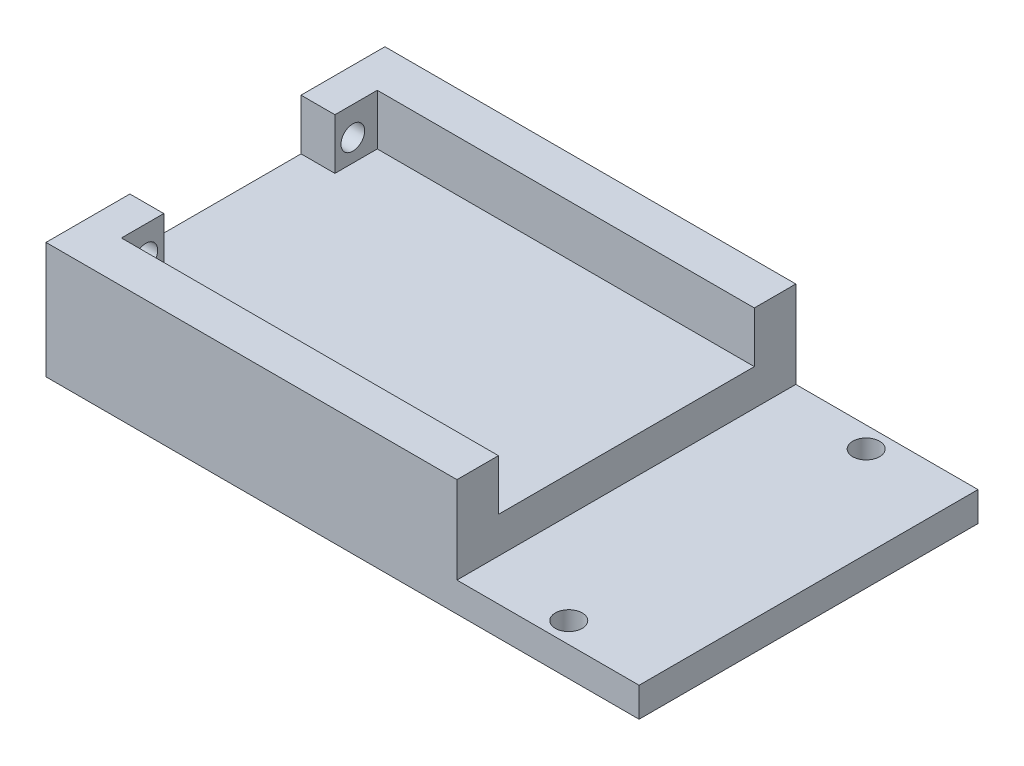
ISO-10303-21;
HEADER;
FILE_DESCRIPTION(('STEP AP214'),'2;1');
FILE_NAME('part.step','',(''),(''),'','','');
FILE_SCHEMA(('AUTOMOTIVE_DESIGN { 1 0 10303 214 1 1 1 1 }'));
ENDSEC;
DATA;
#1=APPLICATION_CONTEXT('core data for automotive mechanical design processes');
#2=APPLICATION_PROTOCOL_DEFINITION('international standard','automotive_design',2000,#1);
#3=PRODUCT_CONTEXT('',#1,'mechanical');
#4=PRODUCT('Part','Part','',(#3));
#5=PRODUCT_RELATED_PRODUCT_CATEGORY('part','',(#4));
#6=PRODUCT_DEFINITION_FORMATION('','',#4);
#7=PRODUCT_DEFINITION_CONTEXT('part definition',#1,'design');
#8=PRODUCT_DEFINITION('design','',#6,#7);
#9=PRODUCT_DEFINITION_SHAPE('','',#8);
#10=(LENGTH_UNIT() NAMED_UNIT(*) SI_UNIT(.MILLI.,.METRE.));
#11=(NAMED_UNIT(*) PLANE_ANGLE_UNIT() SI_UNIT($,.RADIAN.));
#12=(NAMED_UNIT(*) SI_UNIT($,.STERADIAN.) SOLID_ANGLE_UNIT());
#13=UNCERTAINTY_MEASURE_WITH_UNIT(LENGTH_MEASURE(1.E-05),#10,'distance_accuracy_value','');
#14=(GEOMETRIC_REPRESENTATION_CONTEXT(3) GLOBAL_UNCERTAINTY_ASSIGNED_CONTEXT((#13)) GLOBAL_UNIT_ASSIGNED_CONTEXT((#10,
#11,#12)) REPRESENTATION_CONTEXT('',''));
#15=CARTESIAN_POINT('',(0.,0.,0.));
#16=DIRECTION('',(0.,0.,1.));
#17=DIRECTION('',(1.,0.,0.));
#18=AXIS2_PLACEMENT_3D('',#15,#16,#17);
#19=CARTESIAN_POINT('',(0.,15.49,80.));
#20=DIRECTION('',(0.,-1.,0.));
#21=DIRECTION('',(0.,0.,-1.));
#22=AXIS2_PLACEMENT_3D('',#19,#20,#21);
#23=PLANE('',#22);
#24=DIRECTION('',(0.,0.,-1.));
#25=VECTOR('',#24,1.);
#26=CARTESIAN_POINT('',(0.,15.49,80.));
#27=LINE('',#26,#25);
#28=CARTESIAN_POINT('',(0.,15.49,60.2));
#29=VERTEX_POINT('',#28);
#30=CARTESIAN_POINT('',(0.,15.49,19.8));
#31=VERTEX_POINT('',#30);
#32=EDGE_CURVE('E290',#29,#31,#27,.T.);
#33=ORIENTED_EDGE('',*,*,#32,.F.);
#34=DIRECTION('',(1.,0.,0.));
#35=VECTOR('',#34,1.);
#36=CARTESIAN_POINT('',(0.,15.49,60.2));
#37=LINE('',#36,#35);
#38=CARTESIAN_POINT('',(8.,15.49,60.2));
#39=VERTEX_POINT('',#38);
#40=EDGE_CURVE('E192',#29,#39,#37,.T.);
#41=ORIENTED_EDGE('',*,*,#40,.T.);
#42=DIRECTION('',(0.,0.,1.));
#43=VECTOR('',#42,1.);
#44=CARTESIAN_POINT('',(7.99999999999999,15.49,0.));
#45=LINE('',#44,#43);
#46=CARTESIAN_POINT('',(8.,15.49,70.2));
#47=VERTEX_POINT('',#46);
#48=EDGE_CURVE('E151',#39,#47,#45,.T.);
#49=ORIENTED_EDGE('',*,*,#48,.T.);
#50=DIRECTION('',(-1.,0.,0.));
#51=VECTOR('',#50,1.);
#52=CARTESIAN_POINT('',(0.,15.49,70.2));
#53=LINE('',#52,#51);
#54=CARTESIAN_POINT('',(97.,15.49,70.2));
#55=VERTEX_POINT('',#54);
#56=EDGE_CURVE('E169',#55,#47,#53,.T.);
#57=ORIENTED_EDGE('',*,*,#56,.F.);
#58=DIRECTION('',(0.,0.,-1.));
#59=VECTOR('',#58,1.);
#60=CARTESIAN_POINT('',(97.,15.49,80.));
#61=LINE('',#60,#59);
#62=CARTESIAN_POINT('',(97.,15.49,9.8));
#63=VERTEX_POINT('',#62);
#64=EDGE_CURVE('E65',#55,#63,#61,.T.);
#65=ORIENTED_EDGE('',*,*,#64,.T.);
#66=DIRECTION('',(1.,0.,0.));
#67=VECTOR('',#66,1.);
#68=CARTESIAN_POINT('',(0.,15.49,9.8));
#69=LINE('',#68,#67);
#70=CARTESIAN_POINT('',(8.,15.49,9.8));
#71=VERTEX_POINT('',#70);
#72=EDGE_CURVE('E211',#71,#63,#69,.T.);
#73=ORIENTED_EDGE('',*,*,#72,.F.);
#74=DIRECTION('',(0.,0.,-1.));
#75=VECTOR('',#74,1.);
#76=CARTESIAN_POINT('',(8.,15.49,0.));
#77=LINE('',#76,#75);
#78=CARTESIAN_POINT('',(8.,15.49,19.8));
#79=VERTEX_POINT('',#78);
#80=EDGE_CURVE('E59',#79,#71,#77,.T.);
#81=ORIENTED_EDGE('',*,*,#80,.F.);
#82=DIRECTION('',(1.,0.,0.));
#83=VECTOR('',#82,1.);
#84=CARTESIAN_POINT('',(0.,15.49,19.8));
#85=LINE('',#84,#83);
#86=EDGE_CURVE('E157',#31,#79,#85,.T.);
#87=ORIENTED_EDGE('',*,*,#86,.F.);
#88=EDGE_LOOP('',(#33,#41,#49,#57,#65,#73,#81,#87));
#89=FACE_BOUND('',#88,.T.);
#90=ADVANCED_FACE('F41',(#89),#23,.F.);
#91=CARTESIAN_POINT('',(140.,6.95999999999999,80.));
#92=DIRECTION('',(-1.,0.,0.));
#93=DIRECTION('',(0.,0.,1.));
#94=AXIS2_PLACEMENT_3D('',#91,#92,#93);
#95=PLANE('',#94);
#96=DIRECTION('',(0.,1.,0.));
#97=VECTOR('',#96,1.);
#98=CARTESIAN_POINT('',(140.,6.95999999999999,0.));
#99=LINE('',#98,#97);
#100=CARTESIAN_POINT('',(140.,0.,0.));
#101=VERTEX_POINT('',#100);
#102=CARTESIAN_POINT('',(140.,6.95999999999999,0.));
#103=VERTEX_POINT('',#102);
#104=EDGE_CURVE('E250',#101,#103,#99,.T.);
#105=ORIENTED_EDGE('',*,*,#104,.T.);
#106=DIRECTION('',(0.,0.,-1.));
#107=VECTOR('',#106,1.);
#108=CARTESIAN_POINT('',(140.,6.95999999999999,80.));
#109=LINE('',#108,#107);
#110=CARTESIAN_POINT('',(140.,6.95999999999999,80.));
#111=VERTEX_POINT('',#110);
#112=EDGE_CURVE('E11',#111,#103,#109,.T.);
#113=ORIENTED_EDGE('',*,*,#112,.F.);
#114=DIRECTION('',(0.,1.,0.));
#115=VECTOR('',#114,1.);
#116=CARTESIAN_POINT('',(140.,6.95999999999999,80.));
#117=LINE('',#116,#115);
#118=CARTESIAN_POINT('',(140.,0.,80.));
#119=VERTEX_POINT('',#118);
#120=EDGE_CURVE('E251',#119,#111,#117,.T.);
#121=ORIENTED_EDGE('',*,*,#120,.F.);
#122=DIRECTION('',(0.,0.,-1.));
#123=VECTOR('',#122,1.);
#124=CARTESIAN_POINT('',(140.,0.,80.));
#125=LINE('',#124,#123);
#126=EDGE_CURVE('E268',#119,#101,#125,.T.);
#127=ORIENTED_EDGE('',*,*,#126,.T.);
#128=EDGE_LOOP('',(#105,#113,#121,#127));
#129=FACE_BOUND('',#128,.T.);
#130=ADVANCED_FACE('F43',(#129),#95,.F.);
#131=CARTESIAN_POINT('',(97.,6.95999999999999,80.));
#132=DIRECTION('',(0.,-1.,0.));
#133=DIRECTION('',(0.,0.,-1.));
#134=AXIS2_PLACEMENT_3D('',#131,#132,#133);
#135=PLANE('',#134);
#136=CARTESIAN_POINT('',(118.5,6.95999999999999,4.9));
#137=DIRECTION('',(0.,1.,0.));
#138=DIRECTION('',(0.,0.,1.));
#139=AXIS2_PLACEMENT_3D('',#136,#137,#138);
#140=CIRCLE('',#139,3.175);
#141=CARTESIAN_POINT('',(118.5,6.95999999999999,8.075));
#142=VERTEX_POINT('',#141);
#143=EDGE_CURVE('E308',#142,#142,#140,.T.);
#144=ORIENTED_EDGE('',*,*,#143,.F.);
#145=EDGE_LOOP('',(#144));
#146=FACE_BOUND('',#145,.T.);
#147=CARTESIAN_POINT('',(118.5,6.95999999999999,75.1));
#148=DIRECTION('',(0.,1.,0.));
#149=DIRECTION('',(0.,0.,1.));
#150=AXIS2_PLACEMENT_3D('',#147,#148,#149);
#151=CIRCLE('',#150,3.175);
#152=CARTESIAN_POINT('',(118.5,6.95999999999999,78.275));
#153=VERTEX_POINT('',#152);
#154=EDGE_CURVE('E316',#153,#153,#151,.T.);
#155=ORIENTED_EDGE('',*,*,#154,.F.);
#156=EDGE_LOOP('',(#155));
#157=FACE_BOUND('',#156,.T.);
#158=DIRECTION('',(-1.,0.,0.));
#159=VECTOR('',#158,1.);
#160=CARTESIAN_POINT('',(97.,6.95999999999999,0.));
#161=LINE('',#160,#159);
#162=CARTESIAN_POINT('',(97.,6.95999999999999,0.));
#163=VERTEX_POINT('',#162);
#164=EDGE_CURVE('E272',#103,#163,#161,.T.);
#165=ORIENTED_EDGE('',*,*,#164,.T.);
#166=DIRECTION('',(0.,0.,-1.));
#167=VECTOR('',#166,1.);
#168=CARTESIAN_POINT('',(97.,6.95999999999999,80.));
#169=LINE('',#168,#167);
#170=CARTESIAN_POINT('',(97.,6.95999999999999,80.));
#171=VERTEX_POINT('',#170);
#172=EDGE_CURVE('E51',#171,#163,#169,.T.);
#173=ORIENTED_EDGE('',*,*,#172,.F.);
#174=DIRECTION('',(-1.,0.,0.));
#175=VECTOR('',#174,1.);
#176=CARTESIAN_POINT('',(97.,6.95999999999999,80.));
#177=LINE('',#176,#175);
#178=EDGE_CURVE('E255',#111,#171,#177,.T.);
#179=ORIENTED_EDGE('',*,*,#178,.F.);
#180=ORIENTED_EDGE('',*,*,#112,.T.);
#181=EDGE_LOOP('',(#165,#173,#179,#180));
#182=FACE_BOUND('',#181,.T.);
#183=ADVANCED_FACE('F374',(#146,#157,#182),#135,.F.);
#184=CARTESIAN_POINT('',(97.,15.49,80.));
#185=DIRECTION('',(-1.,0.,0.));
#186=DIRECTION('',(0.,0.,1.));
#187=AXIS2_PLACEMENT_3D('',#184,#185,#186);
#188=PLANE('',#187);
#189=DIRECTION('',(0.,1.,0.));
#190=VECTOR('',#189,1.);
#191=CARTESIAN_POINT('',(97.,15.49,0.));
#192=LINE('',#191,#190);
#193=CARTESIAN_POINT('',(97.,27.49,0.));
#194=VERTEX_POINT('',#193);
#195=EDGE_CURVE('E275',#163,#194,#192,.T.);
#196=ORIENTED_EDGE('',*,*,#195,.T.);
#197=DIRECTION('',(0.,0.,-1.));
#198=VECTOR('',#197,1.);
#199=CARTESIAN_POINT('',(97.,27.49,0.));
#200=LINE('',#199,#198);
#201=CARTESIAN_POINT('',(97.,27.49,9.8));
#202=VERTEX_POINT('',#201);
#203=EDGE_CURVE('E217',#202,#194,#200,.T.);
#204=ORIENTED_EDGE('',*,*,#203,.F.);
#205=DIRECTION('',(0.,-1.,0.));
#206=VECTOR('',#205,1.);
#207=CARTESIAN_POINT('',(97.,27.49,9.8));
#208=LINE('',#207,#206);
#209=EDGE_CURVE('E239',#202,#63,#208,.T.);
#210=ORIENTED_EDGE('',*,*,#209,.T.);
#211=ORIENTED_EDGE('',*,*,#64,.F.);
#212=DIRECTION('',(0.,-1.,0.));
#213=VECTOR('',#212,1.);
#214=CARTESIAN_POINT('',(97.,27.49,70.2));
#215=LINE('',#214,#213);
#216=CARTESIAN_POINT('',(97.,27.49,70.2));
#217=VERTEX_POINT('',#216);
#218=EDGE_CURVE('E201',#217,#55,#215,.T.);
#219=ORIENTED_EDGE('',*,*,#218,.F.);
#220=DIRECTION('',(0.,0.,-1.));
#221=VECTOR('',#220,1.);
#222=CARTESIAN_POINT('',(97.,27.49,0.));
#223=LINE('',#222,#221);
#224=CARTESIAN_POINT('',(97.,27.49,80.));
#225=VERTEX_POINT('',#224);
#226=EDGE_CURVE('E184',#225,#217,#223,.T.);
#227=ORIENTED_EDGE('',*,*,#226,.F.);
#228=DIRECTION('',(0.,1.,0.));
#229=VECTOR('',#228,1.);
#230=CARTESIAN_POINT('',(97.,15.49,80.));
#231=LINE('',#230,#229);
#232=EDGE_CURVE('E259',#171,#225,#231,.T.);
#233=ORIENTED_EDGE('',*,*,#232,.F.);
#234=ORIENTED_EDGE('',*,*,#172,.T.);
#235=EDGE_LOOP('',(#196,#204,#210,#211,#219,#227,#233,#234));
#236=FACE_BOUND('',#235,.T.);
#237=ADVANCED_FACE('F336',(#236),#188,.F.);
#238=CARTESIAN_POINT('',(0.,0.,80.));
#239=DIRECTION('',(1.,0.,0.));
#240=DIRECTION('',(0.,0.,-1.));
#241=AXIS2_PLACEMENT_3D('',#238,#239,#240);
#242=PLANE('',#241);
#243=CARTESIAN_POINT('',(0.,20.72,15.57));
#244=DIRECTION('',(-1.,0.,0.));
#245=DIRECTION('',(0.,0.,1.));
#246=AXIS2_PLACEMENT_3D('',#243,#244,#245);
#247=CIRCLE('',#246,2.795);
#248=CARTESIAN_POINT('',(0.,20.72,18.365));
#249=VERTEX_POINT('',#248);
#250=EDGE_CURVE('E302',#249,#249,#247,.T.);
#251=ORIENTED_EDGE('',*,*,#250,.F.);
#252=EDGE_LOOP('',(#251));
#253=FACE_BOUND('',#252,.T.);
#254=CARTESIAN_POINT('',(0.,20.72,64.43));
#255=DIRECTION('',(-1.,0.,0.));
#256=DIRECTION('',(0.,0.,1.));
#257=AXIS2_PLACEMENT_3D('',#254,#255,#256);
#258=CIRCLE('',#257,2.795);
#259=CARTESIAN_POINT('',(0.,20.72,67.225));
#260=VERTEX_POINT('',#259);
#261=EDGE_CURVE('E314',#260,#260,#258,.T.);
#262=ORIENTED_EDGE('',*,*,#261,.F.);
#263=EDGE_LOOP('',(#262));
#264=FACE_BOUND('',#263,.T.);
#265=DIRECTION('',(0.,-1.,0.));
#266=VECTOR('',#265,1.);
#267=CARTESIAN_POINT('',(0.,0.,0.));
#268=LINE('',#267,#266);
#269=CARTESIAN_POINT('',(0.,27.49,0.));
#270=VERTEX_POINT('',#269);
#271=CARTESIAN_POINT('',(0.,0.,0.));
#272=VERTEX_POINT('',#271);
#273=EDGE_CURVE('E278',#270,#272,#268,.T.);
#274=ORIENTED_EDGE('',*,*,#273,.T.);
#275=DIRECTION('',(0.,0.,-1.));
#276=VECTOR('',#275,1.);
#277=CARTESIAN_POINT('',(0.,0.,80.));
#278=LINE('',#277,#276);
#279=CARTESIAN_POINT('',(0.,0.,80.));
#280=VERTEX_POINT('',#279);
#281=EDGE_CURVE('E286',#280,#272,#278,.T.);
#282=ORIENTED_EDGE('',*,*,#281,.F.);
#283=DIRECTION('',(0.,-1.,0.));
#284=VECTOR('',#283,1.);
#285=CARTESIAN_POINT('',(0.,0.,80.));
#286=LINE('',#285,#284);
#287=CARTESIAN_POINT('',(0.,27.49,80.));
#288=VERTEX_POINT('',#287);
#289=EDGE_CURVE('E262',#288,#280,#286,.T.);
#290=ORIENTED_EDGE('',*,*,#289,.F.);
#291=DIRECTION('',(0.,0.,1.));
#292=VECTOR('',#291,1.);
#293=CARTESIAN_POINT('',(0.,27.49,0.));
#294=LINE('',#293,#292);
#295=CARTESIAN_POINT('',(0.,27.49,60.2));
#296=VERTEX_POINT('',#295);
#297=EDGE_CURVE('E174',#296,#288,#294,.T.);
#298=ORIENTED_EDGE('',*,*,#297,.F.);
#299=DIRECTION('',(0.,-1.,0.));
#300=VECTOR('',#299,1.);
#301=CARTESIAN_POINT('',(0.,27.49,60.2));
#302=LINE('',#301,#300);
#303=EDGE_CURVE('E158',#296,#29,#302,.T.);
#304=ORIENTED_EDGE('',*,*,#303,.T.);
#305=ORIENTED_EDGE('',*,*,#32,.T.);
#306=DIRECTION('',(0.,-1.,0.));
#307=VECTOR('',#306,1.);
#308=CARTESIAN_POINT('',(0.,27.49,19.8));
#309=LINE('',#308,#307);
#310=CARTESIAN_POINT('',(0.,27.49,19.8));
#311=VERTEX_POINT('',#310);
#312=EDGE_CURVE('E228',#311,#31,#309,.T.);
#313=ORIENTED_EDGE('',*,*,#312,.F.);
#314=DIRECTION('',(0.,0.,1.));
#315=VECTOR('',#314,1.);
#316=CARTESIAN_POINT('',(0.,27.49,0.));
#317=LINE('',#316,#315);
#318=EDGE_CURVE('E225',#270,#311,#317,.T.);
#319=ORIENTED_EDGE('',*,*,#318,.F.);
#320=EDGE_LOOP('',(#274,#282,#290,#298,#304,#305,#313,#319));
#321=FACE_BOUND('',#320,.T.);
#322=ADVANCED_FACE('F332',(#253,#264,#321),#242,.F.);
#323=CARTESIAN_POINT('',(140.,0.,80.));
#324=DIRECTION('',(0.,1.,0.));
#325=DIRECTION('',(-1.,0.,0.));
#326=AXIS2_PLACEMENT_3D('',#323,#324,#325);
#327=PLANE('',#326);
#328=CARTESIAN_POINT('',(118.5,0.,4.9));
#329=DIRECTION('',(0.,1.,0.));
#330=DIRECTION('',(-1.,0.,0.));
#331=AXIS2_PLACEMENT_3D('',#328,#329,#330);
#332=CIRCLE('',#331,3.175);
#333=CARTESIAN_POINT('',(115.325,0.,4.9));
#334=VERTEX_POINT('',#333);
#335=EDGE_CURVE('E45',#334,#334,#332,.T.);
#336=ORIENTED_EDGE('',*,*,#335,.T.);
#337=EDGE_LOOP('',(#336));
#338=FACE_BOUND('',#337,.T.);
#339=CARTESIAN_POINT('',(118.5,0.,75.1));
#340=DIRECTION('',(0.,1.,0.));
#341=DIRECTION('',(-1.,0.,0.));
#342=AXIS2_PLACEMENT_3D('',#339,#340,#341);
#343=CIRCLE('',#342,3.175);
#344=CARTESIAN_POINT('',(115.325,0.,75.1));
#345=VERTEX_POINT('',#344);
#346=EDGE_CURVE('E305',#345,#345,#343,.T.);
#347=ORIENTED_EDGE('',*,*,#346,.T.);
#348=EDGE_LOOP('',(#347));
#349=FACE_BOUND('',#348,.T.);
#350=DIRECTION('',(1.,0.,0.));
#351=VECTOR('',#350,1.);
#352=CARTESIAN_POINT('',(140.,0.,0.));
#353=LINE('',#352,#351);
#354=EDGE_CURVE('E256',#272,#101,#353,.T.);
#355=ORIENTED_EDGE('',*,*,#354,.T.);
#356=ORIENTED_EDGE('',*,*,#126,.F.);
#357=DIRECTION('',(1.,0.,0.));
#358=VECTOR('',#357,1.);
#359=CARTESIAN_POINT('',(140.,0.,80.));
#360=LINE('',#359,#358);
#361=EDGE_CURVE('E265',#280,#119,#360,.T.);
#362=ORIENTED_EDGE('',*,*,#361,.F.);
#363=ORIENTED_EDGE('',*,*,#281,.T.);
#364=EDGE_LOOP('',(#355,#356,#362,#363));
#365=FACE_BOUND('',#364,.T.);
#366=ADVANCED_FACE('F335',(#338,#349,#365),#327,.F.);
#367=CARTESIAN_POINT('',(0.,0.,80.));
#368=DIRECTION('',(0.,0.,-1.));
#369=DIRECTION('',(-1.,0.,0.));
#370=AXIS2_PLACEMENT_3D('',#367,#368,#369);
#371=PLANE('',#370);
#372=ORIENTED_EDGE('',*,*,#120,.T.);
#373=ORIENTED_EDGE('',*,*,#178,.T.);
#374=ORIENTED_EDGE('',*,*,#232,.T.);
#375=DIRECTION('',(1.,0.,0.));
#376=VECTOR('',#375,1.);
#377=CARTESIAN_POINT('',(0.,27.49,80.));
#378=LINE('',#377,#376);
#379=EDGE_CURVE('E177',#288,#225,#378,.T.);
#380=ORIENTED_EDGE('',*,*,#379,.F.);
#381=ORIENTED_EDGE('',*,*,#289,.T.);
#382=ORIENTED_EDGE('',*,*,#361,.T.);
#383=EDGE_LOOP('',(#372,#373,#374,#380,#381,#382));
#384=FACE_BOUND('',#383,.T.);
#385=ADVANCED_FACE('F355',(#384),#371,.F.);
#386=CARTESIAN_POINT('',(0.,0.,0.));
#387=DIRECTION('',(0.,0.,-1.));
#388=DIRECTION('',(-1.,0.,0.));
#389=AXIS2_PLACEMENT_3D('',#386,#387,#388);
#390=PLANE('',#389);
#391=ORIENTED_EDGE('',*,*,#104,.F.);
#392=ORIENTED_EDGE('',*,*,#354,.F.);
#393=ORIENTED_EDGE('',*,*,#273,.F.);
#394=DIRECTION('',(-1.,0.,0.));
#395=VECTOR('',#394,1.);
#396=CARTESIAN_POINT('',(0.,27.49,0.));
#397=LINE('',#396,#395);
#398=EDGE_CURVE('E221',#194,#270,#397,.T.);
#399=ORIENTED_EDGE('',*,*,#398,.F.);
#400=ORIENTED_EDGE('',*,*,#195,.F.);
#401=ORIENTED_EDGE('',*,*,#164,.F.);
#402=EDGE_LOOP('',(#391,#392,#393,#399,#400,#401));
#403=FACE_BOUND('',#402,.T.);
#404=ADVANCED_FACE('F349',(#403),#390,.T.);
#405=CARTESIAN_POINT('',(0.,27.49,19.8));
#406=DIRECTION('',(0.,0.,-1.));
#407=DIRECTION('',(-1.,0.,0.));
#408=AXIS2_PLACEMENT_3D('',#405,#406,#407);
#409=PLANE('',#408);
#410=ORIENTED_EDGE('',*,*,#86,.T.);
#411=DIRECTION('',(0.,-1.,0.));
#412=VECTOR('',#411,1.);
#413=CARTESIAN_POINT('',(8.,27.49,19.8));
#414=LINE('',#413,#412);
#415=CARTESIAN_POINT('',(8.,27.49,19.8));
#416=VERTEX_POINT('',#415);
#417=EDGE_CURVE('E247',#416,#79,#414,.T.);
#418=ORIENTED_EDGE('',*,*,#417,.F.);
#419=DIRECTION('',(1.,0.,0.));
#420=VECTOR('',#419,1.);
#421=CARTESIAN_POINT('',(0.,27.49,19.8));
#422=LINE('',#421,#420);
#423=EDGE_CURVE('E206',#311,#416,#422,.T.);
#424=ORIENTED_EDGE('',*,*,#423,.F.);
#425=ORIENTED_EDGE('',*,*,#312,.T.);
#426=EDGE_LOOP('',(#410,#418,#424,#425));
#427=FACE_BOUND('',#426,.T.);
#428=ADVANCED_FACE('F368',(#427),#409,.F.);
#429=CARTESIAN_POINT('',(8.,27.49,0.));
#430=DIRECTION('',(-1.,0.,0.));
#431=DIRECTION('',(0.,0.,1.));
#432=AXIS2_PLACEMENT_3D('',#429,#430,#431);
#433=PLANE('',#432);
#434=CARTESIAN_POINT('',(8.,20.72,15.57));
#435=DIRECTION('',(-1.,0.,0.));
#436=DIRECTION('',(0.,0.,1.));
#437=AXIS2_PLACEMENT_3D('',#434,#435,#436);
#438=CIRCLE('',#437,2.795);
#439=CARTESIAN_POINT('',(8.,20.72,18.365));
#440=VERTEX_POINT('',#439);
#441=EDGE_CURVE('E193',#440,#440,#438,.T.);
#442=ORIENTED_EDGE('',*,*,#441,.T.);
#443=EDGE_LOOP('',(#442));
#444=FACE_BOUND('',#443,.T.);
#445=ORIENTED_EDGE('',*,*,#80,.T.);
#446=DIRECTION('',(0.,-1.,0.));
#447=VECTOR('',#446,1.);
#448=CARTESIAN_POINT('',(8.,27.49,9.8));
#449=LINE('',#448,#447);
#450=CARTESIAN_POINT('',(8.,27.49,9.8));
#451=VERTEX_POINT('',#450);
#452=EDGE_CURVE('E243',#451,#71,#449,.T.);
#453=ORIENTED_EDGE('',*,*,#452,.F.);
#454=DIRECTION('',(0.,0.,-1.));
#455=VECTOR('',#454,1.);
#456=CARTESIAN_POINT('',(8.,27.49,0.));
#457=LINE('',#456,#455);
#458=EDGE_CURVE('E210',#416,#451,#457,.T.);
#459=ORIENTED_EDGE('',*,*,#458,.F.);
#460=ORIENTED_EDGE('',*,*,#417,.T.);
#461=EDGE_LOOP('',(#445,#453,#459,#460));
#462=FACE_BOUND('',#461,.T.);
#463=ADVANCED_FACE('F397',(#444,#462),#433,.F.);
#464=CARTESIAN_POINT('',(0.,27.49,9.8));
#465=DIRECTION('',(0.,0.,-1.));
#466=DIRECTION('',(-1.,0.,0.));
#467=AXIS2_PLACEMENT_3D('',#464,#465,#466);
#468=PLANE('',#467);
#469=ORIENTED_EDGE('',*,*,#72,.T.);
#470=ORIENTED_EDGE('',*,*,#209,.F.);
#471=DIRECTION('',(1.,0.,0.));
#472=VECTOR('',#471,1.);
#473=CARTESIAN_POINT('',(0.,27.49,9.8));
#474=LINE('',#473,#472);
#475=EDGE_CURVE('E214',#451,#202,#474,.T.);
#476=ORIENTED_EDGE('',*,*,#475,.F.);
#477=ORIENTED_EDGE('',*,*,#452,.T.);
#478=EDGE_LOOP('',(#469,#470,#476,#477));
#479=FACE_BOUND('',#478,.T.);
#480=ADVANCED_FACE('F400',(#479),#468,.F.);
#481=CARTESIAN_POINT('',(0.,27.49,0.));
#482=DIRECTION('',(0.,1.,0.));
#483=DIRECTION('',(0.,0.,1.));
#484=AXIS2_PLACEMENT_3D('',#481,#482,#483);
#485=PLANE('',#484);
#486=ORIENTED_EDGE('',*,*,#423,.T.);
#487=ORIENTED_EDGE('',*,*,#458,.T.);
#488=ORIENTED_EDGE('',*,*,#475,.T.);
#489=ORIENTED_EDGE('',*,*,#203,.T.);
#490=ORIENTED_EDGE('',*,*,#398,.T.);
#491=ORIENTED_EDGE('',*,*,#318,.T.);
#492=EDGE_LOOP('',(#486,#487,#488,#489,#490,#491));
#493=FACE_BOUND('',#492,.T.);
#494=ADVANCED_FACE('F370',(#493),#485,.T.);
#495=CARTESIAN_POINT('',(7.99999999999999,27.49,0.));
#496=DIRECTION('',(1.,0.,0.));
#497=DIRECTION('',(0.,0.,-1.));
#498=AXIS2_PLACEMENT_3D('',#495,#496,#497);
#499=PLANE('',#498);
#500=CARTESIAN_POINT('',(8.00000000000001,20.72,64.43));
#501=DIRECTION('',(1.,0.,0.));
#502=DIRECTION('',(0.,0.,-1.));
#503=AXIS2_PLACEMENT_3D('',#500,#501,#502);
#504=CIRCLE('',#503,2.795);
#505=CARTESIAN_POINT('',(8.00000000000001,20.72,61.635));
#506=VERTEX_POINT('',#505);
#507=EDGE_CURVE('E298',#506,#506,#504,.T.);
#508=ORIENTED_EDGE('',*,*,#507,.F.);
#509=EDGE_LOOP('',(#508));
#510=FACE_BOUND('',#509,.T.);
#511=ORIENTED_EDGE('',*,*,#48,.F.);
#512=DIRECTION('',(0.,-1.,0.));
#513=VECTOR('',#512,1.);
#514=CARTESIAN_POINT('',(8.,27.49,60.2));
#515=LINE('',#514,#513);
#516=CARTESIAN_POINT('',(8.,27.49,60.2));
#517=VERTEX_POINT('',#516);
#518=EDGE_CURVE('E146',#517,#39,#515,.T.);
#519=ORIENTED_EDGE('',*,*,#518,.F.);
#520=DIRECTION('',(0.,0.,1.));
#521=VECTOR('',#520,1.);
#522=CARTESIAN_POINT('',(7.99999999999999,27.49,0.));
#523=LINE('',#522,#521);
#524=CARTESIAN_POINT('',(8.,27.49,70.2));
#525=VERTEX_POINT('',#524);
#526=EDGE_CURVE('E149',#517,#525,#523,.T.);
#527=ORIENTED_EDGE('',*,*,#526,.T.);
#528=DIRECTION('',(0.,-1.,0.));
#529=VECTOR('',#528,1.);
#530=CARTESIAN_POINT('',(8.,27.49,70.2));
#531=LINE('',#530,#529);
#532=EDGE_CURVE('E189',#525,#47,#531,.T.);
#533=ORIENTED_EDGE('',*,*,#532,.T.);
#534=EDGE_LOOP('',(#511,#519,#527,#533));
#535=FACE_BOUND('',#534,.T.);
#536=ADVANCED_FACE('F148',(#510,#535),#499,.T.);
#537=CARTESIAN_POINT('',(0.,27.49,60.2));
#538=DIRECTION('',(0.,0.,-1.));
#539=DIRECTION('',(-1.,0.,0.));
#540=AXIS2_PLACEMENT_3D('',#537,#538,#539);
#541=PLANE('',#540);
#542=ORIENTED_EDGE('',*,*,#40,.F.);
#543=ORIENTED_EDGE('',*,*,#303,.F.);
#544=DIRECTION('',(1.,0.,0.));
#545=VECTOR('',#544,1.);
#546=CARTESIAN_POINT('',(0.,27.49,60.2));
#547=LINE('',#546,#545);
#548=EDGE_CURVE('E164',#296,#517,#547,.T.);
#549=ORIENTED_EDGE('',*,*,#548,.T.);
#550=ORIENTED_EDGE('',*,*,#518,.T.);
#551=EDGE_LOOP('',(#542,#543,#549,#550));
#552=FACE_BOUND('',#551,.T.);
#553=ADVANCED_FACE('F171',(#552),#541,.T.);
#554=CARTESIAN_POINT('',(0.,27.49,70.2));
#555=DIRECTION('',(0.,0.,1.));
#556=DIRECTION('',(1.,0.,0.));
#557=AXIS2_PLACEMENT_3D('',#554,#555,#556);
#558=PLANE('',#557);
#559=ORIENTED_EDGE('',*,*,#56,.T.);
#560=ORIENTED_EDGE('',*,*,#532,.F.);
#561=DIRECTION('',(-1.,0.,0.));
#562=VECTOR('',#561,1.);
#563=CARTESIAN_POINT('',(0.,27.49,70.2));
#564=LINE('',#563,#562);
#565=EDGE_CURVE('E166',#217,#525,#564,.T.);
#566=ORIENTED_EDGE('',*,*,#565,.F.);
#567=ORIENTED_EDGE('',*,*,#218,.T.);
#568=EDGE_LOOP('',(#559,#560,#566,#567));
#569=FACE_BOUND('',#568,.T.);
#570=ADVANCED_FACE('F363',(#569),#558,.F.);
#571=CARTESIAN_POINT('',(0.,27.49,0.));
#572=DIRECTION('',(0.,1.,0.));
#573=DIRECTION('',(0.,0.,1.));
#574=AXIS2_PLACEMENT_3D('',#571,#572,#573);
#575=PLANE('',#574);
#576=ORIENTED_EDGE('',*,*,#526,.F.);
#577=ORIENTED_EDGE('',*,*,#548,.F.);
#578=ORIENTED_EDGE('',*,*,#297,.T.);
#579=ORIENTED_EDGE('',*,*,#379,.T.);
#580=ORIENTED_EDGE('',*,*,#226,.T.);
#581=ORIENTED_EDGE('',*,*,#565,.T.);
#582=EDGE_LOOP('',(#576,#577,#578,#579,#580,#581));
#583=FACE_BOUND('',#582,.T.);
#584=ADVANCED_FACE('F162',(#583),#575,.T.);
#585=CARTESIAN_POINT('',(60.,20.72,64.43));
#586=DIRECTION('',(-1.,0.,0.));
#587=DIRECTION('',(0.,0.,1.));
#588=AXIS2_PLACEMENT_3D('',#585,#586,#587);
#589=CYLINDRICAL_SURFACE('',#588,2.795);
#590=ORIENTED_EDGE('',*,*,#507,.T.);
#591=EDGE_LOOP('',(#590));
#592=FACE_BOUND('',#591,.T.);
#593=ORIENTED_EDGE('',*,*,#261,.T.);
#594=EDGE_LOOP('',(#593));
#595=FACE_BOUND('',#594,.T.);
#596=ADVANCED_FACE('F330',(#592,#595),#589,.F.);
#597=CARTESIAN_POINT('',(60.,20.72,15.57));
#598=DIRECTION('',(-1.,0.,0.));
#599=DIRECTION('',(0.,0.,1.));
#600=AXIS2_PLACEMENT_3D('',#597,#598,#599);
#601=CYLINDRICAL_SURFACE('',#600,2.795);
#602=ORIENTED_EDGE('',*,*,#250,.T.);
#603=EDGE_LOOP('',(#602));
#604=FACE_BOUND('',#603,.T.);
#605=ORIENTED_EDGE('',*,*,#441,.F.);
#606=EDGE_LOOP('',(#605));
#607=FACE_BOUND('',#606,.T.);
#608=ADVANCED_FACE('F418',(#604,#607),#601,.F.);
#609=CARTESIAN_POINT('',(118.5,-3.04000000000001,75.1));
#610=DIRECTION('',(0.,1.,0.));
#611=DIRECTION('',(0.,0.,1.));
#612=AXIS2_PLACEMENT_3D('',#609,#610,#611);
#613=CYLINDRICAL_SURFACE('',#612,3.175);
#614=ORIENTED_EDGE('',*,*,#154,.T.);
#615=EDGE_LOOP('',(#614));
#616=FACE_BOUND('',#615,.T.);
#617=ORIENTED_EDGE('',*,*,#346,.F.);
#618=EDGE_LOOP('',(#617));
#619=FACE_BOUND('',#618,.T.);
#620=ADVANCED_FACE('F422',(#616,#619),#613,.F.);
#621=CARTESIAN_POINT('',(118.5,-3.04000000000001,4.9));
#622=DIRECTION('',(0.,1.,0.));
#623=DIRECTION('',(0.,0.,1.));
#624=AXIS2_PLACEMENT_3D('',#621,#622,#623);
#625=CYLINDRICAL_SURFACE('',#624,3.175);
#626=ORIENTED_EDGE('',*,*,#143,.T.);
#627=EDGE_LOOP('',(#626));
#628=FACE_BOUND('',#627,.T.);
#629=ORIENTED_EDGE('',*,*,#335,.F.);
#630=EDGE_LOOP('',(#629));
#631=FACE_BOUND('',#630,.T.);
#632=ADVANCED_FACE('F426',(#628,#631),#625,.F.);
#633=CLOSED_SHELL('',(#90,#130,#183,#237,#322,#366,#385,#404,#428,#463,#480,#494,#536,#553,#570,
#584,#596,#608,#620,#632));
#634=MANIFOLD_SOLID_BREP('B2',#633);
#635=ADVANCED_BREP_SHAPE_REPRESENTATION('',(#18,#634),#14);
#636=SHAPE_DEFINITION_REPRESENTATION(#9,#635);
ENDSEC;
END-ISO-10303-21;
